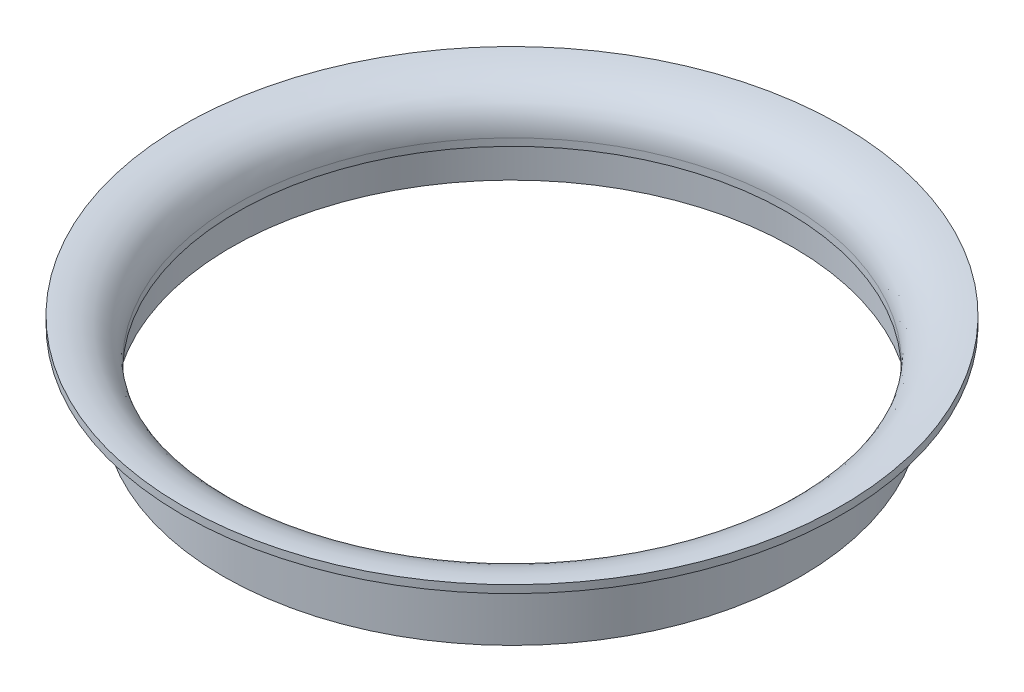
ISO-10303-21;
HEADER;
FILE_DESCRIPTION(('STEP AP214'),'2;1');
FILE_NAME('part.step','',(''),(''),'','','');
FILE_SCHEMA(('AUTOMOTIVE_DESIGN { 1 0 10303 214 1 1 1 1 }'));
ENDSEC;
DATA;
#1=APPLICATION_CONTEXT('core data for automotive mechanical design processes');
#2=APPLICATION_PROTOCOL_DEFINITION('international standard','automotive_design',2000,#1);
#3=PRODUCT_CONTEXT('',#1,'mechanical');
#4=PRODUCT('Part','Part','',(#3));
#5=PRODUCT_RELATED_PRODUCT_CATEGORY('part','',(#4));
#6=PRODUCT_DEFINITION_FORMATION('','',#4);
#7=PRODUCT_DEFINITION_CONTEXT('part definition',#1,'design');
#8=PRODUCT_DEFINITION('design','',#6,#7);
#9=PRODUCT_DEFINITION_SHAPE('','',#8);
#10=(LENGTH_UNIT() NAMED_UNIT(*) SI_UNIT(.MILLI.,.METRE.));
#11=(NAMED_UNIT(*) PLANE_ANGLE_UNIT() SI_UNIT($,.RADIAN.));
#12=(NAMED_UNIT(*) SI_UNIT($,.STERADIAN.) SOLID_ANGLE_UNIT());
#13=UNCERTAINTY_MEASURE_WITH_UNIT(LENGTH_MEASURE(1.E-05),#10,'distance_accuracy_value','');
#14=(GEOMETRIC_REPRESENTATION_CONTEXT(3) GLOBAL_UNCERTAINTY_ASSIGNED_CONTEXT((#13)) GLOBAL_UNIT_ASSIGNED_CONTEXT((#10,
#11,#12)) REPRESENTATION_CONTEXT('',''));
#15=CARTESIAN_POINT('',(0.,0.,0.));
#16=DIRECTION('',(0.,0.,1.));
#17=DIRECTION('',(1.,0.,0.));
#18=AXIS2_PLACEMENT_3D('',#15,#16,#17);
#19=CARTESIAN_POINT('',(35.5,5.24627743789975,0.));
#20=CARTESIAN_POINT('',(35.5,8.14344764127997,0.));
#21=CARTESIAN_POINT('',(37.3081765336788,10.5,0.));
#22=CARTESIAN_POINT('',(42.5,10.5,0.));
#23=B_SPLINE_CURVE_WITH_KNOTS('',3,(#19,#20,#21,#22),.UNSPECIFIED.,.F.,.F.,(4,4),(0.,1.),.UNSPECIFIED.);
#24=CARTESIAN_POINT('',(0.,0.,0.));
#25=DIRECTION('',(0.,-1.,0.));
#26=AXIS1_PLACEMENT('',#24,#25);
#27=SURFACE_OF_REVOLUTION('',#23,#26);
#28=CARTESIAN_POINT('',(0.,10.5,0.));
#29=DIRECTION('',(0.,-1.,0.));
#30=DIRECTION('',(0.,0.,-1.));
#31=AXIS2_PLACEMENT_3D('',#28,#29,#30);
#32=CIRCLE('',#31,42.5);
#33=CARTESIAN_POINT('',(0.,10.5,-42.5));
#34=VERTEX_POINT('',#33);
#35=EDGE_CURVE('E66',#34,#34,#32,.T.);
#36=ORIENTED_EDGE('',*,*,#35,.F.);
#37=EDGE_LOOP('',(#36));
#38=FACE_BOUND('',#37,.T.);
#39=CARTESIAN_POINT('',(0.,5.24627743789975,0.));
#40=DIRECTION('',(0.,-1.,0.));
#41=DIRECTION('',(0.,0.,-1.));
#42=AXIS2_PLACEMENT_3D('',#39,#40,#41);
#43=CIRCLE('',#42,35.5);
#44=CARTESIAN_POINT('',(0.,5.24627743789975,-35.5));
#45=VERTEX_POINT('',#44);
#46=EDGE_CURVE('E10',#45,#45,#43,.T.);
#47=ORIENTED_EDGE('',*,*,#46,.T.);
#48=EDGE_LOOP('',(#47));
#49=FACE_BOUND('',#48,.T.);
#50=ADVANCED_FACE('F37',(#38,#49),#27,.T.);
#51=CARTESIAN_POINT('',(0.,0.,0.));
#52=DIRECTION('',(0.,-1.,0.));
#53=DIRECTION('',(0.,0.,-1.));
#54=AXIS2_PLACEMENT_3D('',#51,#52,#53);
#55=CYLINDRICAL_SURFACE('',#54,35.5);
#56=CARTESIAN_POINT('',(0.,4.3,0.));
#57=DIRECTION('',(0.,-1.,0.));
#58=DIRECTION('',(0.,0.,-1.));
#59=AXIS2_PLACEMENT_3D('',#56,#57,#58);
#60=CIRCLE('',#59,35.5);
#61=CARTESIAN_POINT('',(0.,4.3,-35.5));
#62=VERTEX_POINT('',#61);
#63=EDGE_CURVE('E44',#62,#62,#60,.T.);
#64=ORIENTED_EDGE('',*,*,#63,.T.);
#65=EDGE_LOOP('',(#64));
#66=FACE_BOUND('',#65,.T.);
#67=ORIENTED_EDGE('',*,*,#46,.F.);
#68=EDGE_LOOP('',(#67));
#69=FACE_BOUND('',#68,.T.);
#70=ADVANCED_FACE('F99',(#66,#69),#55,.F.);
#71=CARTESIAN_POINT('',(0.,4.3,0.));
#72=DIRECTION('',(0.,-1.,0.));
#73=DIRECTION('',(0.,0.,-1.));
#74=AXIS2_PLACEMENT_3D('',#71,#72,#73);
#75=PLANE('',#74);
#76=CARTESIAN_POINT('',(0.,4.3,0.));
#77=DIRECTION('',(0.,-1.,0.));
#78=DIRECTION('',(0.,0.,-1.));
#79=AXIS2_PLACEMENT_3D('',#76,#77,#78);
#80=CIRCLE('',#79,36.25);
#81=CARTESIAN_POINT('',(0.,4.3,-36.25));
#82=VERTEX_POINT('',#81);
#83=EDGE_CURVE('E48',#82,#82,#80,.T.);
#84=ORIENTED_EDGE('',*,*,#83,.T.);
#85=EDGE_LOOP('',(#84));
#86=FACE_BOUND('',#85,.T.);
#87=ORIENTED_EDGE('',*,*,#63,.F.);
#88=EDGE_LOOP('',(#87));
#89=FACE_BOUND('',#88,.T.);
#90=ADVANCED_FACE('F96',(#86,#89),#75,.T.);
#91=CARTESIAN_POINT('',(0.,0.,0.));
#92=DIRECTION('',(0.,-1.,0.));
#93=DIRECTION('',(0.,0.,-1.));
#94=AXIS2_PLACEMENT_3D('',#91,#92,#93);
#95=CYLINDRICAL_SURFACE('',#94,36.25);
#96=CARTESIAN_POINT('',(0.,0.,0.));
#97=DIRECTION('',(0.,-1.,0.));
#98=DIRECTION('',(0.,0.,-1.));
#99=AXIS2_PLACEMENT_3D('',#96,#97,#98);
#100=CIRCLE('',#99,36.25);
#101=CARTESIAN_POINT('',(0.,0.,-36.25));
#102=VERTEX_POINT('',#101);
#103=EDGE_CURVE('E52',#102,#102,#100,.T.);
#104=ORIENTED_EDGE('',*,*,#103,.T.);
#105=EDGE_LOOP('',(#104));
#106=FACE_BOUND('',#105,.T.);
#107=ORIENTED_EDGE('',*,*,#83,.F.);
#108=EDGE_LOOP('',(#107));
#109=FACE_BOUND('',#108,.T.);
#110=ADVANCED_FACE('F92',(#106,#109),#95,.F.);
#111=CARTESIAN_POINT('',(0.,0.,0.));
#112=DIRECTION('',(0.,-1.,0.));
#113=DIRECTION('',(0.,0.,-1.));
#114=AXIS2_PLACEMENT_3D('',#111,#112,#113);
#115=PLANE('',#114);
#116=CARTESIAN_POINT('',(0.,0.,0.));
#117=DIRECTION('',(0.,-1.,0.));
#118=DIRECTION('',(0.,0.,-1.));
#119=AXIS2_PLACEMENT_3D('',#116,#117,#118);
#120=CIRCLE('',#119,37.25);
#121=CARTESIAN_POINT('',(0.,0.,-37.25));
#122=VERTEX_POINT('',#121);
#123=EDGE_CURVE('E57',#122,#122,#120,.T.);
#124=ORIENTED_EDGE('',*,*,#123,.T.);
#125=EDGE_LOOP('',(#124));
#126=FACE_BOUND('',#125,.T.);
#127=ORIENTED_EDGE('',*,*,#103,.F.);
#128=EDGE_LOOP('',(#127));
#129=FACE_BOUND('',#128,.T.);
#130=ADVANCED_FACE('F88',(#126,#129),#115,.T.);
#131=CARTESIAN_POINT('',(0.,0.,0.));
#132=DIRECTION('',(0.,-1.,0.));
#133=DIRECTION('',(0.,0.,-1.));
#134=AXIS2_PLACEMENT_3D('',#131,#132,#133);
#135=CYLINDRICAL_SURFACE('',#134,37.25);
#136=CARTESIAN_POINT('',(0.,6.,0.));
#137=DIRECTION('',(0.,-1.,0.));
#138=DIRECTION('',(0.,0.,-1.));
#139=AXIS2_PLACEMENT_3D('',#136,#137,#138);
#140=CIRCLE('',#139,37.25);
#141=CARTESIAN_POINT('',(0.,6.,-37.25));
#142=VERTEX_POINT('',#141);
#143=EDGE_CURVE('E60',#142,#142,#140,.T.);
#144=ORIENTED_EDGE('',*,*,#143,.T.);
#145=EDGE_LOOP('',(#144));
#146=FACE_BOUND('',#145,.T.);
#147=ORIENTED_EDGE('',*,*,#123,.F.);
#148=EDGE_LOOP('',(#147));
#149=FACE_BOUND('',#148,.T.);
#150=ADVANCED_FACE('F84',(#146,#149),#135,.T.);
#151=CARTESIAN_POINT('',(37.25,6.,0.));
#152=CARTESIAN_POINT('',(37.25,8.10323824402067,0.));
#153=CARTESIAN_POINT('',(38.992444761643,9.5,0.));
#154=CARTESIAN_POINT('',(42.5,9.5,0.));
#155=B_SPLINE_CURVE_WITH_KNOTS('',3,(#151,#152,#153,#154),.UNSPECIFIED.,.F.,.F.,(4,4),(0.,1.),.UNSPECIFIED.);
#156=CARTESIAN_POINT('',(0.,0.,0.));
#157=DIRECTION('',(0.,-1.,0.));
#158=AXIS1_PLACEMENT('',#156,#157);
#159=SURFACE_OF_REVOLUTION('',#155,#158);
#160=CARTESIAN_POINT('',(0.,9.5,0.));
#161=DIRECTION('',(0.,-1.,0.));
#162=DIRECTION('',(0.,0.,-1.));
#163=AXIS2_PLACEMENT_3D('',#160,#161,#162);
#164=CIRCLE('',#163,42.5);
#165=CARTESIAN_POINT('',(0.,9.5,-42.5));
#166=VERTEX_POINT('',#165);
#167=EDGE_CURVE('E63',#166,#166,#164,.T.);
#168=ORIENTED_EDGE('',*,*,#167,.T.);
#169=EDGE_LOOP('',(#168));
#170=FACE_BOUND('',#169,.T.);
#171=ORIENTED_EDGE('',*,*,#143,.F.);
#172=EDGE_LOOP('',(#171));
#173=FACE_BOUND('',#172,.T.);
#174=ADVANCED_FACE('F79',(#170,#173),#159,.F.);
#175=CARTESIAN_POINT('',(0.,0.,0.));
#176=DIRECTION('',(0.,-1.,0.));
#177=DIRECTION('',(0.,0.,-1.));
#178=AXIS2_PLACEMENT_3D('',#175,#176,#177);
#179=CYLINDRICAL_SURFACE('',#178,42.5);
#180=ORIENTED_EDGE('',*,*,#35,.T.);
#181=EDGE_LOOP('',(#180));
#182=FACE_BOUND('',#181,.T.);
#183=ORIENTED_EDGE('',*,*,#167,.F.);
#184=EDGE_LOOP('',(#183));
#185=FACE_BOUND('',#184,.T.);
#186=ADVANCED_FACE('F83',(#182,#185),#179,.T.);
#187=CLOSED_SHELL('',(#50,#70,#90,#110,#130,#150,#174,#186));
#188=MANIFOLD_SOLID_BREP('B2',#187);
#189=ADVANCED_BREP_SHAPE_REPRESENTATION('',(#18,#188),#14);
#190=SHAPE_DEFINITION_REPRESENTATION(#9,#189);
ENDSEC;
END-ISO-10303-21;
